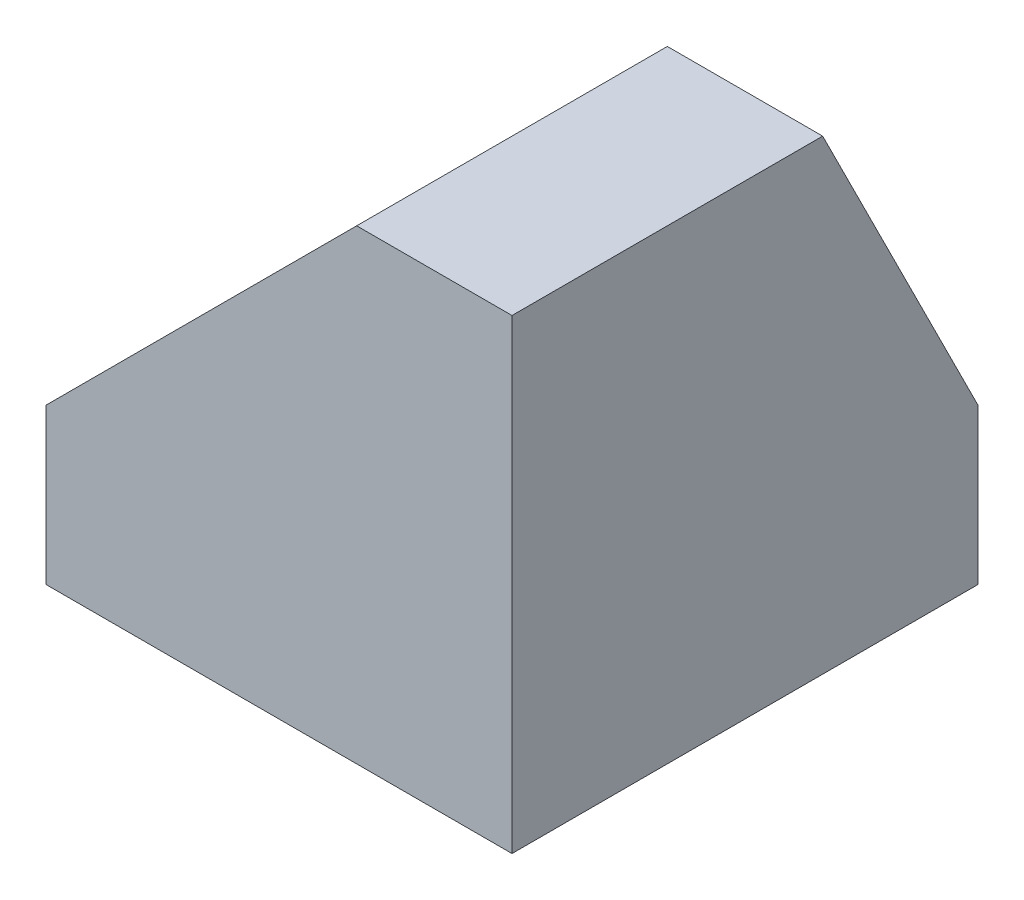
ISO-10303-21;
HEADER;
FILE_DESCRIPTION(('STEP AP214'),'2;1');
FILE_NAME('part.step','',(''),(''),'','','');
FILE_SCHEMA(('AUTOMOTIVE_DESIGN { 1 0 10303 214 1 1 1 1 }'));
ENDSEC;
DATA;
#1=APPLICATION_CONTEXT('core data for automotive mechanical design processes');
#2=APPLICATION_PROTOCOL_DEFINITION('international standard','automotive_design',2000,#1);
#3=PRODUCT_CONTEXT('',#1,'mechanical');
#4=PRODUCT('Part','Part','',(#3));
#5=PRODUCT_RELATED_PRODUCT_CATEGORY('part','',(#4));
#6=PRODUCT_DEFINITION_FORMATION('','',#4);
#7=PRODUCT_DEFINITION_CONTEXT('part definition',#1,'design');
#8=PRODUCT_DEFINITION('design','',#6,#7);
#9=PRODUCT_DEFINITION_SHAPE('','',#8);
#10=(LENGTH_UNIT() NAMED_UNIT(*) SI_UNIT(.MILLI.,.METRE.));
#11=(NAMED_UNIT(*) PLANE_ANGLE_UNIT() SI_UNIT($,.RADIAN.));
#12=(NAMED_UNIT(*) SI_UNIT($,.STERADIAN.) SOLID_ANGLE_UNIT());
#13=UNCERTAINTY_MEASURE_WITH_UNIT(LENGTH_MEASURE(1.E-05),#10,'distance_accuracy_value','');
#14=(GEOMETRIC_REPRESENTATION_CONTEXT(3) GLOBAL_UNCERTAINTY_ASSIGNED_CONTEXT((#13)) GLOBAL_UNIT_ASSIGNED_CONTEXT((#10,
#11,#12)) REPRESENTATION_CONTEXT('',''));
#15=CARTESIAN_POINT('',(0.,0.,0.));
#16=DIRECTION('',(0.,0.,1.));
#17=DIRECTION('',(1.,0.,0.));
#18=AXIS2_PLACEMENT_3D('',#15,#16,#17);
#19=CARTESIAN_POINT('',(0.,0.,-40.));
#20=DIRECTION('',(0.,0.,1.));
#21=DIRECTION('',(1.,0.,0.));
#22=AXIS2_PLACEMENT_3D('',#19,#20,#21);
#23=PLANE('',#22);
#24=DIRECTION('',(0.,-1.,0.));
#25=VECTOR('',#24,1.);
#26=CARTESIAN_POINT('',(40.,20.,-40.));
#27=LINE('',#26,#25);
#28=CARTESIAN_POINT('',(40.,60.,-40.));
#29=VERTEX_POINT('',#28);
#30=CARTESIAN_POINT('',(40.,20.,-40.));
#31=VERTEX_POINT('',#30);
#32=EDGE_CURVE('E204',#29,#31,#27,.T.);
#33=ORIENTED_EDGE('',*,*,#32,.T.);
#34=DIRECTION('',(0.894427190999916,0.447213595499958,0.));
#35=VECTOR('',#34,1.);
#36=CARTESIAN_POINT('',(40.,20.,-40.));
#37=LINE('',#36,#35);
#38=CARTESIAN_POINT('',(0.,0.,-40.));
#39=VERTEX_POINT('',#38);
#40=EDGE_CURVE('E175',#39,#31,#37,.T.);
#41=ORIENTED_EDGE('',*,*,#40,.F.);
#42=DIRECTION('',(0.,-1.,0.));
#43=VECTOR('',#42,1.);
#44=CARTESIAN_POINT('',(0.,20.,-40.));
#45=LINE('',#44,#43);
#46=CARTESIAN_POINT('',(0.,20.,-40.));
#47=VERTEX_POINT('',#46);
#48=EDGE_CURVE('E101',#47,#39,#45,.T.);
#49=ORIENTED_EDGE('',*,*,#48,.F.);
#50=DIRECTION('',(-0.707106781186547,-0.707106781186548,0.));
#51=VECTOR('',#50,1.);
#52=CARTESIAN_POINT('',(0.,20.,-40.));
#53=LINE('',#52,#51);
#54=EDGE_CURVE('E86',#29,#47,#53,.T.);
#55=ORIENTED_EDGE('',*,*,#54,.F.);
#56=EDGE_LOOP('',(#33,#41,#49,#55));
#57=FACE_BOUND('',#56,.T.);
#58=ADVANCED_FACE('F39',(#57),#23,.F.);
#59=CARTESIAN_POINT('',(0.,20.,-40.));
#60=DIRECTION('',(-1.,0.,0.));
#61=DIRECTION('',(0.,0.,1.));
#62=AXIS2_PLACEMENT_3D('',#59,#60,#61);
#63=PLANE('',#62);
#64=DIRECTION('',(0.,-1.,0.));
#65=VECTOR('',#64,1.);
#66=CARTESIAN_POINT('',(0.,20.,0.));
#67=LINE('',#66,#65);
#68=CARTESIAN_POINT('',(0.,20.,0.));
#69=VERTEX_POINT('',#68);
#70=CARTESIAN_POINT('',(0.,0.,0.));
#71=VERTEX_POINT('',#70);
#72=EDGE_CURVE('E88',#69,#71,#67,.T.);
#73=ORIENTED_EDGE('',*,*,#72,.F.);
#74=DIRECTION('',(0.,0.,1.));
#75=VECTOR('',#74,1.);
#76=CARTESIAN_POINT('',(0.,20.,-40.));
#77=LINE('',#76,#75);
#78=EDGE_CURVE('E11',#47,#69,#77,.T.);
#79=ORIENTED_EDGE('',*,*,#78,.F.);
#80=ORIENTED_EDGE('',*,*,#48,.T.);
#81=DIRECTION('',(0.,0.,1.));
#82=VECTOR('',#81,1.);
#83=CARTESIAN_POINT('',(0.,0.,-40.));
#84=LINE('',#83,#82);
#85=EDGE_CURVE('E43',#39,#71,#84,.T.);
#86=ORIENTED_EDGE('',*,*,#85,.T.);
#87=EDGE_LOOP('',(#73,#79,#80,#86));
#88=FACE_BOUND('',#87,.T.);
#89=ADVANCED_FACE('F41',(#88),#63,.T.);
#90=CARTESIAN_POINT('',(0.,20.,-40.));
#91=DIRECTION('',(-0.707106781186548,0.707106781186547,0.));
#92=DIRECTION('',(-0.707106781186547,-0.707106781186548,0.));
#93=AXIS2_PLACEMENT_3D('',#90,#91,#92);
#94=PLANE('',#93);
#95=DIRECTION('',(-0.707106781186547,-0.707106781186548,0.));
#96=VECTOR('',#95,1.);
#97=CARTESIAN_POINT('',(0.,20.,0.));
#98=LINE('',#97,#96);
#99=CARTESIAN_POINT('',(40.,60.,0.));
#100=VERTEX_POINT('',#99);
#101=EDGE_CURVE('E84',#100,#69,#98,.T.);
#102=ORIENTED_EDGE('',*,*,#101,.F.);
#103=DIRECTION('',(0.,0.,1.));
#104=VECTOR('',#103,1.);
#105=CARTESIAN_POINT('',(40.,60.,-40.));
#106=LINE('',#105,#104);
#107=EDGE_CURVE('E50',#29,#100,#106,.T.);
#108=ORIENTED_EDGE('',*,*,#107,.F.);
#109=ORIENTED_EDGE('',*,*,#54,.T.);
#110=ORIENTED_EDGE('',*,*,#78,.T.);
#111=EDGE_LOOP('',(#102,#108,#109,#110));
#112=FACE_BOUND('',#111,.T.);
#113=ADVANCED_FACE('F82',(#112),#94,.T.);
#114=CARTESIAN_POINT('',(40.,60.,-40.));
#115=DIRECTION('',(0.,1.,0.));
#116=DIRECTION('',(-1.,0.,0.));
#117=AXIS2_PLACEMENT_3D('',#114,#115,#116);
#118=PLANE('',#117);
#119=DIRECTION('',(-1.,0.,0.));
#120=VECTOR('',#119,1.);
#121=CARTESIAN_POINT('',(40.,60.,0.));
#122=LINE('',#121,#120);
#123=CARTESIAN_POINT('',(60.,60.,0.));
#124=VERTEX_POINT('',#123);
#125=EDGE_CURVE('E99',#124,#100,#122,.T.);
#126=ORIENTED_EDGE('',*,*,#125,.F.);
#127=DIRECTION('',(0.,0.,1.));
#128=VECTOR('',#127,1.);
#129=CARTESIAN_POINT('',(60.,60.,-40.));
#130=LINE('',#129,#128);
#131=CARTESIAN_POINT('',(60.,60.,-40.));
#132=VERTEX_POINT('',#131);
#133=EDGE_CURVE('E113',#132,#124,#130,.T.);
#134=ORIENTED_EDGE('',*,*,#133,.F.);
#135=DIRECTION('',(-1.,0.,0.));
#136=VECTOR('',#135,1.);
#137=CARTESIAN_POINT('',(40.,60.,-40.));
#138=LINE('',#137,#136);
#139=EDGE_CURVE('E105',#132,#29,#138,.T.);
#140=ORIENTED_EDGE('',*,*,#139,.T.);
#141=ORIENTED_EDGE('',*,*,#107,.T.);
#142=EDGE_LOOP('',(#126,#134,#140,#141));
#143=FACE_BOUND('',#142,.T.);
#144=ADVANCED_FACE('F138',(#143),#118,.T.);
#145=CARTESIAN_POINT('',(60.,0.,-40.));
#146=DIRECTION('',(1.,0.,0.));
#147=DIRECTION('',(0.,0.,-1.));
#148=AXIS2_PLACEMENT_3D('',#145,#146,#147);
#149=PLANE('',#148);
#150=DIRECTION('',(0.,0.894427190999916,0.447213595499958));
#151=VECTOR('',#150,1.);
#152=CARTESIAN_POINT('',(60.,60.,-40.));
#153=LINE('',#152,#151);
#154=CARTESIAN_POINT('',(60.,20.,-60.));
#155=VERTEX_POINT('',#154);
#156=EDGE_CURVE('E137',#155,#132,#153,.T.);
#157=ORIENTED_EDGE('',*,*,#156,.T.);
#158=ORIENTED_EDGE('',*,*,#133,.T.);
#159=DIRECTION('',(0.,1.,0.));
#160=VECTOR('',#159,1.);
#161=CARTESIAN_POINT('',(60.,0.,0.));
#162=LINE('',#161,#160);
#163=CARTESIAN_POINT('',(60.,0.,0.));
#164=VERTEX_POINT('',#163);
#165=EDGE_CURVE('E107',#164,#124,#162,.T.);
#166=ORIENTED_EDGE('',*,*,#165,.F.);
#167=DIRECTION('',(0.,0.,1.));
#168=VECTOR('',#167,1.);
#169=CARTESIAN_POINT('',(60.,0.,-40.));
#170=LINE('',#169,#168);
#171=CARTESIAN_POINT('',(60.,0.,-60.));
#172=VERTEX_POINT('',#171);
#173=EDGE_CURVE('E115',#172,#164,#170,.T.);
#174=ORIENTED_EDGE('',*,*,#173,.F.);
#175=DIRECTION('',(0.,-1.,0.));
#176=VECTOR('',#175,1.);
#177=CARTESIAN_POINT('',(60.,0.,-60.));
#178=LINE('',#177,#176);
#179=EDGE_CURVE('E188',#155,#172,#178,.T.);
#180=ORIENTED_EDGE('',*,*,#179,.F.);
#181=EDGE_LOOP('',(#157,#158,#166,#174,#180));
#182=FACE_BOUND('',#181,.T.);
#183=ADVANCED_FACE('F131',(#182),#149,.T.);
#184=CARTESIAN_POINT('',(0.,0.,-40.));
#185=DIRECTION('',(0.,-1.,0.));
#186=DIRECTION('',(0.,0.,-1.));
#187=AXIS2_PLACEMENT_3D('',#184,#185,#186);
#188=PLANE('',#187);
#189=DIRECTION('',(1.,0.,0.));
#190=VECTOR('',#189,1.);
#191=CARTESIAN_POINT('',(0.,0.,0.));
#192=LINE('',#191,#190);
#193=EDGE_CURVE('E94',#71,#164,#192,.T.);
#194=ORIENTED_EDGE('',*,*,#193,.F.);
#195=ORIENTED_EDGE('',*,*,#85,.F.);
#196=DIRECTION('',(0.,0.,1.));
#197=VECTOR('',#196,1.);
#198=CARTESIAN_POINT('',(0.,0.,-60.));
#199=LINE('',#198,#197);
#200=CARTESIAN_POINT('',(0.,0.,-60.));
#201=VERTEX_POINT('',#200);
#202=EDGE_CURVE('E95',#201,#39,#199,.T.);
#203=ORIENTED_EDGE('',*,*,#202,.F.);
#204=DIRECTION('',(-1.,0.,0.));
#205=VECTOR('',#204,1.);
#206=CARTESIAN_POINT('',(0.,0.,-60.));
#207=LINE('',#206,#205);
#208=EDGE_CURVE('E195',#172,#201,#207,.T.);
#209=ORIENTED_EDGE('',*,*,#208,.F.);
#210=ORIENTED_EDGE('',*,*,#173,.T.);
#211=EDGE_LOOP('',(#194,#195,#203,#209,#210));
#212=FACE_BOUND('',#211,.T.);
#213=ADVANCED_FACE('F145',(#212),#188,.T.);
#214=CARTESIAN_POINT('',(0.,0.,0.));
#215=DIRECTION('',(0.,0.,1.));
#216=DIRECTION('',(1.,0.,0.));
#217=AXIS2_PLACEMENT_3D('',#214,#215,#216);
#218=PLANE('',#217);
#219=ORIENTED_EDGE('',*,*,#72,.T.);
#220=ORIENTED_EDGE('',*,*,#193,.T.);
#221=ORIENTED_EDGE('',*,*,#165,.T.);
#222=ORIENTED_EDGE('',*,*,#125,.T.);
#223=ORIENTED_EDGE('',*,*,#101,.T.);
#224=EDGE_LOOP('',(#219,#220,#221,#222,#223));
#225=FACE_BOUND('',#224,.T.);
#226=ADVANCED_FACE('F97',(#225),#218,.T.);
#227=CARTESIAN_POINT('',(40.,20.,-60.));
#228=DIRECTION('',(0.447213595499958,-0.894427190999916,0.));
#229=DIRECTION('',(0.894427190999916,0.447213595499958,0.));
#230=AXIS2_PLACEMENT_3D('',#227,#228,#229);
#231=PLANE('',#230);
#232=ORIENTED_EDGE('',*,*,#40,.T.);
#233=DIRECTION('',(0.,0.,1.));
#234=VECTOR('',#233,1.);
#235=CARTESIAN_POINT('',(40.,20.,-60.));
#236=LINE('',#235,#234);
#237=CARTESIAN_POINT('',(40.,20.,-60.));
#238=VERTEX_POINT('',#237);
#239=EDGE_CURVE('E179',#238,#31,#236,.T.);
#240=ORIENTED_EDGE('',*,*,#239,.F.);
#241=DIRECTION('',(0.894427190999916,0.447213595499958,0.));
#242=VECTOR('',#241,1.);
#243=CARTESIAN_POINT('',(40.,20.,-60.));
#244=LINE('',#243,#242);
#245=EDGE_CURVE('E177',#201,#238,#244,.T.);
#246=ORIENTED_EDGE('',*,*,#245,.F.);
#247=ORIENTED_EDGE('',*,*,#202,.T.);
#248=EDGE_LOOP('',(#232,#240,#246,#247));
#249=FACE_BOUND('',#248,.T.);
#250=ADVANCED_FACE('F157',(#249),#231,.F.);
#251=CARTESIAN_POINT('',(0.,0.,-60.));
#252=DIRECTION('',(0.,0.,1.));
#253=DIRECTION('',(1.,0.,0.));
#254=AXIS2_PLACEMENT_3D('',#251,#252,#253);
#255=PLANE('',#254);
#256=ORIENTED_EDGE('',*,*,#179,.T.);
#257=ORIENTED_EDGE('',*,*,#208,.T.);
#258=ORIENTED_EDGE('',*,*,#245,.T.);
#259=DIRECTION('',(1.,0.,0.));
#260=VECTOR('',#259,1.);
#261=CARTESIAN_POINT('',(60.,20.,-60.));
#262=LINE('',#261,#260);
#263=EDGE_CURVE('E183',#238,#155,#262,.T.);
#264=ORIENTED_EDGE('',*,*,#263,.T.);
#265=EDGE_LOOP('',(#256,#257,#258,#264));
#266=FACE_BOUND('',#265,.T.);
#267=ADVANCED_FACE('F164',(#266),#255,.F.);
#268=CARTESIAN_POINT('',(40.,60.,-40.));
#269=DIRECTION('',(0.,0.447213595499958,-0.894427190999916));
#270=DIRECTION('',(0.,0.894427190999916,0.447213595499958));
#271=AXIS2_PLACEMENT_3D('',#268,#269,#270);
#272=PLANE('',#271);
#273=ORIENTED_EDGE('',*,*,#156,.F.);
#274=ORIENTED_EDGE('',*,*,#263,.F.);
#275=DIRECTION('',(0.,0.894427190999916,0.447213595499958));
#276=VECTOR('',#275,1.);
#277=CARTESIAN_POINT('',(40.,60.,-40.));
#278=LINE('',#277,#276);
#279=EDGE_CURVE('E189',#238,#29,#278,.T.);
#280=ORIENTED_EDGE('',*,*,#279,.T.);
#281=ORIENTED_EDGE('',*,*,#139,.F.);
#282=EDGE_LOOP('',(#273,#274,#280,#281));
#283=FACE_BOUND('',#282,.T.);
#284=ADVANCED_FACE('F220',(#283),#272,.T.);
#285=CARTESIAN_POINT('',(40.,0.,0.));
#286=DIRECTION('',(1.,0.,0.));
#287=DIRECTION('',(0.,0.,-1.));
#288=AXIS2_PLACEMENT_3D('',#285,#286,#287);
#289=PLANE('',#288);
#290=ORIENTED_EDGE('',*,*,#32,.F.);
#291=ORIENTED_EDGE('',*,*,#279,.F.);
#292=ORIENTED_EDGE('',*,*,#239,.T.);
#293=EDGE_LOOP('',(#290,#291,#292));
#294=FACE_BOUND('',#293,.T.);
#295=ADVANCED_FACE('F215',(#294),#289,.F.);
#296=CLOSED_SHELL('',(#58,#89,#113,#144,#183,#213,#226,#250,#267,#284,#295));
#297=MANIFOLD_SOLID_BREP('B2',#296);
#298=ADVANCED_BREP_SHAPE_REPRESENTATION('',(#18,#297),#14);
#299=SHAPE_DEFINITION_REPRESENTATION(#9,#298);
ENDSEC;
END-ISO-10303-21;
